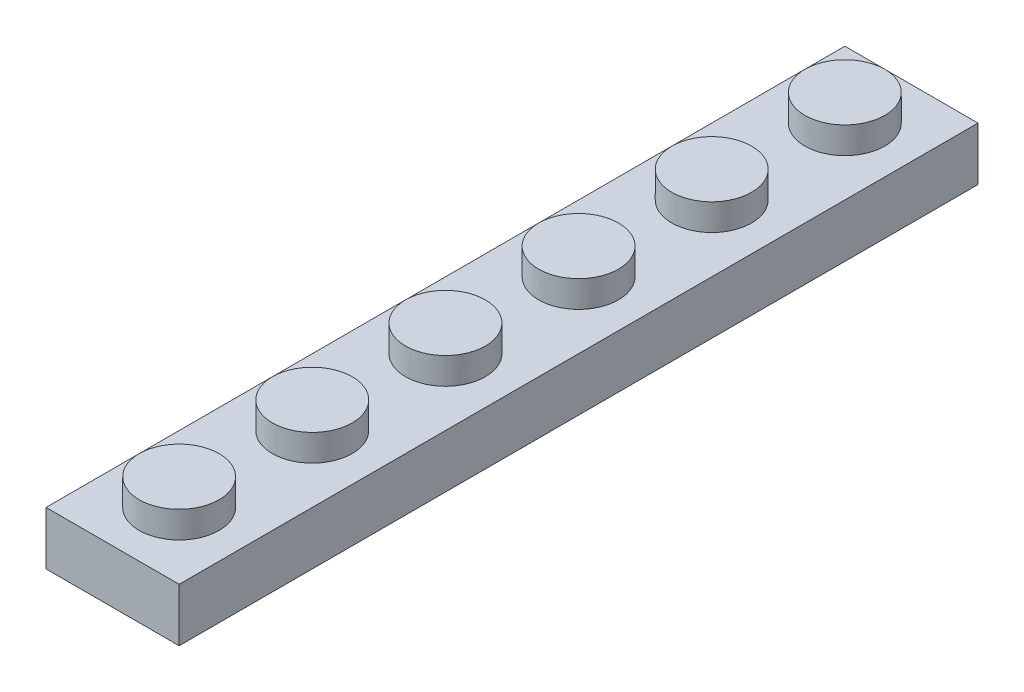
ISO-10303-21;
HEADER;
FILE_DESCRIPTION(('STEP AP214'),'2;1');
FILE_NAME('part.step','',(''),(''),'','','');
FILE_SCHEMA(('AUTOMOTIVE_DESIGN { 1 0 10303 214 1 1 1 1 }'));
ENDSEC;
DATA;
#1=APPLICATION_CONTEXT('core data for automotive mechanical design processes');
#2=APPLICATION_PROTOCOL_DEFINITION('international standard','automotive_design',2000,#1);
#3=PRODUCT_CONTEXT('',#1,'mechanical');
#4=PRODUCT('Part','Part','',(#3));
#5=PRODUCT_RELATED_PRODUCT_CATEGORY('part','',(#4));
#6=PRODUCT_DEFINITION_FORMATION('','',#4);
#7=PRODUCT_DEFINITION_CONTEXT('part definition',#1,'design');
#8=PRODUCT_DEFINITION('design','',#6,#7);
#9=PRODUCT_DEFINITION_SHAPE('','',#8);
#10=(LENGTH_UNIT() NAMED_UNIT(*) SI_UNIT(.MILLI.,.METRE.));
#11=(NAMED_UNIT(*) PLANE_ANGLE_UNIT() SI_UNIT($,.RADIAN.));
#12=(NAMED_UNIT(*) SI_UNIT($,.STERADIAN.) SOLID_ANGLE_UNIT());
#13=UNCERTAINTY_MEASURE_WITH_UNIT(LENGTH_MEASURE(1.E-05),#10,'distance_accuracy_value','');
#14=(GEOMETRIC_REPRESENTATION_CONTEXT(3) GLOBAL_UNCERTAINTY_ASSIGNED_CONTEXT((#13)) GLOBAL_UNIT_ASSIGNED_CONTEXT((#10,
#11,#12)) REPRESENTATION_CONTEXT('',''));
#15=CARTESIAN_POINT('',(0.,0.,0.));
#16=DIRECTION('',(0.,0.,1.));
#17=DIRECTION('',(1.,0.,0.));
#18=AXIS2_PLACEMENT_3D('',#15,#16,#17);
#19=CARTESIAN_POINT('',(0.,0.,0.));
#20=DIRECTION('',(0.,-1.,0.));
#21=DIRECTION('',(0.,0.,-1.));
#22=AXIS2_PLACEMENT_3D('',#19,#20,#21);
#23=PLANE('',#22);
#24=DIRECTION('',(0.,0.,1.));
#25=VECTOR('',#24,1.);
#26=CARTESIAN_POINT('',(0.,0.,0.));
#27=LINE('',#26,#25);
#28=CARTESIAN_POINT('',(0.,0.,-48.));
#29=VERTEX_POINT('',#28);
#30=CARTESIAN_POINT('',(0.,0.,0.));
#31=VERTEX_POINT('',#30);
#32=EDGE_CURVE('E208',#29,#31,#27,.T.);
#33=ORIENTED_EDGE('',*,*,#32,.F.);
#34=DIRECTION('',(-1.,0.,0.));
#35=VECTOR('',#34,1.);
#36=CARTESIAN_POINT('',(0.,0.,-48.));
#37=LINE('',#36,#35);
#38=CARTESIAN_POINT('',(8.,0.,-48.));
#39=VERTEX_POINT('',#38);
#40=EDGE_CURVE('E85',#39,#29,#37,.T.);
#41=ORIENTED_EDGE('',*,*,#40,.F.);
#42=DIRECTION('',(0.,0.,-1.));
#43=VECTOR('',#42,1.);
#44=CARTESIAN_POINT('',(8.,0.,0.));
#45=LINE('',#44,#43);
#46=CARTESIAN_POINT('',(8.,0.,0.));
#47=VERTEX_POINT('',#46);
#48=EDGE_CURVE('E226',#47,#39,#45,.T.);
#49=ORIENTED_EDGE('',*,*,#48,.F.);
#50=DIRECTION('',(1.,0.,0.));
#51=VECTOR('',#50,1.);
#52=CARTESIAN_POINT('',(0.,0.,0.));
#53=LINE('',#52,#51);
#54=EDGE_CURVE('E223',#31,#47,#53,.T.);
#55=ORIENTED_EDGE('',*,*,#54,.F.);
#56=EDGE_LOOP('',(#33,#41,#49,#55));
#57=FACE_BOUND('',#56,.T.);
#58=DIRECTION('',(-1.,0.,0.));
#59=VECTOR('',#58,1.);
#60=CARTESIAN_POINT('',(0.,0.,-46.4));
#61=LINE('',#60,#59);
#62=CARTESIAN_POINT('',(6.4,0.,-46.4));
#63=VERTEX_POINT('',#62);
#64=CARTESIAN_POINT('',(1.6,0.,-46.4));
#65=VERTEX_POINT('',#64);
#66=EDGE_CURVE('E191',#63,#65,#61,.T.);
#67=ORIENTED_EDGE('',*,*,#66,.T.);
#68=DIRECTION('',(0.,0.,1.));
#69=VECTOR('',#68,1.);
#70=CARTESIAN_POINT('',(1.6,0.,0.));
#71=LINE('',#70,#69);
#72=CARTESIAN_POINT('',(1.6,0.,-1.6));
#73=VERTEX_POINT('',#72);
#74=EDGE_CURVE('E182',#65,#73,#71,.T.);
#75=ORIENTED_EDGE('',*,*,#74,.T.);
#76=DIRECTION('',(1.,0.,0.));
#77=VECTOR('',#76,1.);
#78=CARTESIAN_POINT('',(0.,0.,-1.6));
#79=LINE('',#78,#77);
#80=CARTESIAN_POINT('',(6.4,0.,-1.6));
#81=VERTEX_POINT('',#80);
#82=EDGE_CURVE('E190',#73,#81,#79,.T.);
#83=ORIENTED_EDGE('',*,*,#82,.T.);
#84=DIRECTION('',(0.,0.,-1.));
#85=VECTOR('',#84,1.);
#86=CARTESIAN_POINT('',(6.4,0.,0.));
#87=LINE('',#86,#85);
#88=EDGE_CURVE('E55',#81,#63,#87,.T.);
#89=ORIENTED_EDGE('',*,*,#88,.T.);
#90=EDGE_LOOP('',(#67,#75,#83,#89));
#91=FACE_BOUND('',#90,.T.);
#92=ADVANCED_FACE('F39',(#57,#91),#23,.T.);
#93=CARTESIAN_POINT('',(4.,4.8,-44.));
#94=DIRECTION('',(0.,1.,0.));
#95=DIRECTION('',(0.,0.,1.));
#96=AXIS2_PLACEMENT_3D('',#93,#94,#95);
#97=PLANE('',#96);
#98=CARTESIAN_POINT('',(4.,4.8,-44.));
#99=DIRECTION('',(0.,1.,0.));
#100=DIRECTION('',(0.,0.,1.));
#101=AXIS2_PLACEMENT_3D('',#98,#99,#100);
#102=CIRCLE('',#101,2.4);
#103=CARTESIAN_POINT('',(4.,4.8,-41.6));
#104=VERTEX_POINT('',#103);
#105=EDGE_CURVE('E11',#104,#104,#102,.T.);
#106=ORIENTED_EDGE('',*,*,#105,.T.);
#107=EDGE_LOOP('',(#106));
#108=FACE_BOUND('',#107,.T.);
#109=ADVANCED_FACE('F41',(#108),#97,.T.);
#110=CARTESIAN_POINT('',(4.,4.8,-44.));
#111=DIRECTION('',(0.,-1.,0.));
#112=DIRECTION('',(0.,0.,-1.));
#113=AXIS2_PLACEMENT_3D('',#110,#111,#112);
#114=CYLINDRICAL_SURFACE('',#113,2.4);
#115=ORIENTED_EDGE('',*,*,#105,.F.);
#116=EDGE_LOOP('',(#115));
#117=FACE_BOUND('',#116,.T.);
#118=CARTESIAN_POINT('',(4.,3.2,-44.));
#119=DIRECTION('',(0.,-1.,0.));
#120=DIRECTION('',(0.,0.,-1.));
#121=AXIS2_PLACEMENT_3D('',#118,#119,#120);
#122=CIRCLE('',#121,2.4);
#123=CARTESIAN_POINT('',(4.,3.2,-46.4));
#124=VERTEX_POINT('',#123);
#125=EDGE_CURVE('E48',#124,#124,#122,.F.);
#126=ORIENTED_EDGE('',*,*,#125,.T.);
#127=EDGE_LOOP('',(#126));
#128=FACE_BOUND('',#127,.T.);
#129=ADVANCED_FACE('F278',(#117,#128),#114,.T.);
#130=CARTESIAN_POINT('',(4.,4.8,-36.));
#131=DIRECTION('',(0.,1.,0.));
#132=DIRECTION('',(0.,0.,1.));
#133=AXIS2_PLACEMENT_3D('',#130,#131,#132);
#134=PLANE('',#133);
#135=CARTESIAN_POINT('',(4.,4.8,-36.));
#136=DIRECTION('',(0.,1.,0.));
#137=DIRECTION('',(0.,0.,1.));
#138=AXIS2_PLACEMENT_3D('',#135,#136,#137);
#139=CIRCLE('',#138,2.4);
#140=CARTESIAN_POINT('',(4.,4.8,-33.6));
#141=VERTEX_POINT('',#140);
#142=EDGE_CURVE('E271',#141,#141,#139,.T.);
#143=ORIENTED_EDGE('',*,*,#142,.T.);
#144=EDGE_LOOP('',(#143));
#145=FACE_BOUND('',#144,.T.);
#146=ADVANCED_FACE('F336',(#145),#134,.T.);
#147=CARTESIAN_POINT('',(4.,4.8,-36.));
#148=DIRECTION('',(0.,-1.,0.));
#149=DIRECTION('',(0.,0.,-1.));
#150=AXIS2_PLACEMENT_3D('',#147,#148,#149);
#151=CYLINDRICAL_SURFACE('',#150,2.4);
#152=ORIENTED_EDGE('',*,*,#142,.F.);
#153=EDGE_LOOP('',(#152));
#154=FACE_BOUND('',#153,.T.);
#155=CARTESIAN_POINT('',(4.,3.2,-36.));
#156=DIRECTION('',(0.,-1.,0.));
#157=DIRECTION('',(0.,0.,-1.));
#158=AXIS2_PLACEMENT_3D('',#155,#156,#157);
#159=CIRCLE('',#158,2.4);
#160=CARTESIAN_POINT('',(4.,3.2,-38.4));
#161=VERTEX_POINT('',#160);
#162=EDGE_CURVE('E267',#161,#161,#159,.F.);
#163=ORIENTED_EDGE('',*,*,#162,.T.);
#164=EDGE_LOOP('',(#163));
#165=FACE_BOUND('',#164,.T.);
#166=ADVANCED_FACE('F332',(#154,#165),#151,.T.);
#167=CARTESIAN_POINT('',(4.,4.8,-28.));
#168=DIRECTION('',(0.,1.,0.));
#169=DIRECTION('',(0.,0.,1.));
#170=AXIS2_PLACEMENT_3D('',#167,#168,#169);
#171=PLANE('',#170);
#172=CARTESIAN_POINT('',(4.,4.8,-28.));
#173=DIRECTION('',(0.,1.,0.));
#174=DIRECTION('',(0.,0.,1.));
#175=AXIS2_PLACEMENT_3D('',#172,#173,#174);
#176=CIRCLE('',#175,2.4);
#177=CARTESIAN_POINT('',(4.,4.8,-25.6));
#178=VERTEX_POINT('',#177);
#179=EDGE_CURVE('E263',#178,#178,#176,.T.);
#180=ORIENTED_EDGE('',*,*,#179,.T.);
#181=EDGE_LOOP('',(#180));
#182=FACE_BOUND('',#181,.T.);
#183=ADVANCED_FACE('F328',(#182),#171,.T.);
#184=CARTESIAN_POINT('',(4.,4.8,-28.));
#185=DIRECTION('',(0.,-1.,0.));
#186=DIRECTION('',(0.,0.,-1.));
#187=AXIS2_PLACEMENT_3D('',#184,#185,#186);
#188=CYLINDRICAL_SURFACE('',#187,2.4);
#189=ORIENTED_EDGE('',*,*,#179,.F.);
#190=EDGE_LOOP('',(#189));
#191=FACE_BOUND('',#190,.T.);
#192=CARTESIAN_POINT('',(4.,3.2,-28.));
#193=DIRECTION('',(0.,-1.,0.));
#194=DIRECTION('',(0.,0.,-1.));
#195=AXIS2_PLACEMENT_3D('',#192,#193,#194);
#196=CIRCLE('',#195,2.4);
#197=CARTESIAN_POINT('',(4.,3.2,-30.4));
#198=VERTEX_POINT('',#197);
#199=EDGE_CURVE('E259',#198,#198,#196,.F.);
#200=ORIENTED_EDGE('',*,*,#199,.T.);
#201=EDGE_LOOP('',(#200));
#202=FACE_BOUND('',#201,.T.);
#203=ADVANCED_FACE('F324',(#191,#202),#188,.T.);
#204=CARTESIAN_POINT('',(4.,4.8,-20.));
#205=DIRECTION('',(0.,1.,0.));
#206=DIRECTION('',(0.,0.,1.));
#207=AXIS2_PLACEMENT_3D('',#204,#205,#206);
#208=PLANE('',#207);
#209=CARTESIAN_POINT('',(4.,4.8,-20.));
#210=DIRECTION('',(0.,1.,0.));
#211=DIRECTION('',(0.,0.,1.));
#212=AXIS2_PLACEMENT_3D('',#209,#210,#211);
#213=CIRCLE('',#212,2.4);
#214=CARTESIAN_POINT('',(4.,4.8,-17.6));
#215=VERTEX_POINT('',#214);
#216=EDGE_CURVE('E255',#215,#215,#213,.T.);
#217=ORIENTED_EDGE('',*,*,#216,.T.);
#218=EDGE_LOOP('',(#217));
#219=FACE_BOUND('',#218,.T.);
#220=ADVANCED_FACE('F320',(#219),#208,.T.);
#221=CARTESIAN_POINT('',(4.,4.8,-20.));
#222=DIRECTION('',(0.,-1.,0.));
#223=DIRECTION('',(0.,0.,-1.));
#224=AXIS2_PLACEMENT_3D('',#221,#222,#223);
#225=CYLINDRICAL_SURFACE('',#224,2.4);
#226=ORIENTED_EDGE('',*,*,#216,.F.);
#227=EDGE_LOOP('',(#226));
#228=FACE_BOUND('',#227,.T.);
#229=CARTESIAN_POINT('',(4.,3.2,-20.));
#230=DIRECTION('',(0.,-1.,0.));
#231=DIRECTION('',(0.,0.,-1.));
#232=AXIS2_PLACEMENT_3D('',#229,#230,#231);
#233=CIRCLE('',#232,2.4);
#234=CARTESIAN_POINT('',(4.,3.2,-22.4));
#235=VERTEX_POINT('',#234);
#236=EDGE_CURVE('E251',#235,#235,#233,.F.);
#237=ORIENTED_EDGE('',*,*,#236,.T.);
#238=EDGE_LOOP('',(#237));
#239=FACE_BOUND('',#238,.T.);
#240=ADVANCED_FACE('F316',(#228,#239),#225,.T.);
#241=CARTESIAN_POINT('',(0.,3.2,0.));
#242=DIRECTION('',(1.,0.,0.));
#243=DIRECTION('',(0.,0.,-1.));
#244=AXIS2_PLACEMENT_3D('',#241,#242,#243);
#245=PLANE('',#244);
#246=ORIENTED_EDGE('',*,*,#32,.T.);
#247=DIRECTION('',(0.,-1.,0.));
#248=VECTOR('',#247,1.);
#249=CARTESIAN_POINT('',(0.,3.2,0.));
#250=LINE('',#249,#248);
#251=CARTESIAN_POINT('',(0.,3.2,0.));
#252=VERTEX_POINT('',#251);
#253=EDGE_CURVE('E240',#252,#31,#250,.T.);
#254=ORIENTED_EDGE('',*,*,#253,.F.);
#255=DIRECTION('',(0.,0.,1.));
#256=VECTOR('',#255,1.);
#257=CARTESIAN_POINT('',(0.,3.2,0.));
#258=LINE('',#257,#256);
#259=CARTESIAN_POINT('',(0.,3.2,-48.));
#260=VERTEX_POINT('',#259);
#261=EDGE_CURVE('E209',#260,#252,#258,.T.);
#262=ORIENTED_EDGE('',*,*,#261,.F.);
#263=DIRECTION('',(0.,-1.,0.));
#264=VECTOR('',#263,1.);
#265=CARTESIAN_POINT('',(0.,3.2,-48.));
#266=LINE('',#265,#264);
#267=EDGE_CURVE('E219',#260,#29,#266,.T.);
#268=ORIENTED_EDGE('',*,*,#267,.T.);
#269=EDGE_LOOP('',(#246,#254,#262,#268));
#270=FACE_BOUND('',#269,.T.);
#271=ADVANCED_FACE('F313',(#270),#245,.F.);
#272=CARTESIAN_POINT('',(0.,3.2,0.));
#273=DIRECTION('',(0.,0.,-1.));
#274=DIRECTION('',(-1.,0.,0.));
#275=AXIS2_PLACEMENT_3D('',#272,#273,#274);
#276=PLANE('',#275);
#277=ORIENTED_EDGE('',*,*,#54,.T.);
#278=DIRECTION('',(0.,-1.,0.));
#279=VECTOR('',#278,1.);
#280=CARTESIAN_POINT('',(8.,3.2,0.));
#281=LINE('',#280,#279);
#282=CARTESIAN_POINT('',(8.,3.2,0.));
#283=VERTEX_POINT('',#282);
#284=EDGE_CURVE('E236',#283,#47,#281,.T.);
#285=ORIENTED_EDGE('',*,*,#284,.F.);
#286=DIRECTION('',(1.,0.,0.));
#287=VECTOR('',#286,1.);
#288=CARTESIAN_POINT('',(0.,3.2,0.));
#289=LINE('',#288,#287);
#290=EDGE_CURVE('E93',#252,#283,#289,.T.);
#291=ORIENTED_EDGE('',*,*,#290,.F.);
#292=ORIENTED_EDGE('',*,*,#253,.T.);
#293=EDGE_LOOP('',(#277,#285,#291,#292));
#294=FACE_BOUND('',#293,.T.);
#295=ADVANCED_FACE('F309',(#294),#276,.F.);
#296=CARTESIAN_POINT('',(8.,3.2,0.));
#297=DIRECTION('',(-1.,0.,0.));
#298=DIRECTION('',(0.,0.,1.));
#299=AXIS2_PLACEMENT_3D('',#296,#297,#298);
#300=PLANE('',#299);
#301=ORIENTED_EDGE('',*,*,#48,.T.);
#302=DIRECTION('',(0.,-1.,0.));
#303=VECTOR('',#302,1.);
#304=CARTESIAN_POINT('',(8.,3.2,-48.));
#305=LINE('',#304,#303);
#306=CARTESIAN_POINT('',(8.,3.2,-48.));
#307=VERTEX_POINT('',#306);
#308=EDGE_CURVE('E233',#307,#39,#305,.T.);
#309=ORIENTED_EDGE('',*,*,#308,.F.);
#310=DIRECTION('',(0.,0.,-1.));
#311=VECTOR('',#310,1.);
#312=CARTESIAN_POINT('',(8.,3.2,0.));
#313=LINE('',#312,#311);
#314=EDGE_CURVE('E214',#283,#307,#313,.T.);
#315=ORIENTED_EDGE('',*,*,#314,.F.);
#316=ORIENTED_EDGE('',*,*,#284,.T.);
#317=EDGE_LOOP('',(#301,#309,#315,#316));
#318=FACE_BOUND('',#317,.T.);
#319=ADVANCED_FACE('F293',(#318),#300,.F.);
#320=CARTESIAN_POINT('',(0.,3.2,-48.));
#321=DIRECTION('',(0.,0.,1.));
#322=DIRECTION('',(1.,0.,0.));
#323=AXIS2_PLACEMENT_3D('',#320,#321,#322);
#324=PLANE('',#323);
#325=ORIENTED_EDGE('',*,*,#40,.T.);
#326=ORIENTED_EDGE('',*,*,#267,.F.);
#327=DIRECTION('',(-1.,0.,0.));
#328=VECTOR('',#327,1.);
#329=CARTESIAN_POINT('',(0.,3.2,-48.));
#330=LINE('',#329,#328);
#331=EDGE_CURVE('E64',#307,#260,#330,.T.);
#332=ORIENTED_EDGE('',*,*,#331,.F.);
#333=ORIENTED_EDGE('',*,*,#308,.T.);
#334=EDGE_LOOP('',(#325,#326,#332,#333));
#335=FACE_BOUND('',#334,.T.);
#336=ADVANCED_FACE('F283',(#335),#324,.F.);
#337=CARTESIAN_POINT('',(0.,3.2,0.));
#338=DIRECTION('',(0.,-1.,0.));
#339=DIRECTION('',(0.,0.,-1.));
#340=AXIS2_PLACEMENT_3D('',#337,#338,#339);
#341=PLANE('',#340);
#342=CARTESIAN_POINT('',(4.,3.2,-12.));
#343=DIRECTION('',(0.,-1.,0.));
#344=DIRECTION('',(0.,0.,-1.));
#345=AXIS2_PLACEMENT_3D('',#342,#343,#344);
#346=CIRCLE('',#345,2.4);
#347=CARTESIAN_POINT('',(4.,3.2,-14.4));
#348=VERTEX_POINT('',#347);
#349=EDGE_CURVE('E247',#348,#348,#346,.F.);
#350=ORIENTED_EDGE('',*,*,#349,.F.);
#351=EDGE_LOOP('',(#350));
#352=FACE_BOUND('',#351,.T.);
#353=CARTESIAN_POINT('',(4.,3.2,-4.));
#354=DIRECTION('',(0.,-1.,0.));
#355=DIRECTION('',(0.,0.,-1.));
#356=AXIS2_PLACEMENT_3D('',#353,#354,#355);
#357=CIRCLE('',#356,2.4);
#358=CARTESIAN_POINT('',(4.,3.2,-6.4));
#359=VERTEX_POINT('',#358);
#360=EDGE_CURVE('E243',#359,#359,#357,.F.);
#361=ORIENTED_EDGE('',*,*,#360,.F.);
#362=EDGE_LOOP('',(#361));
#363=FACE_BOUND('',#362,.T.);
#364=ORIENTED_EDGE('',*,*,#261,.T.);
#365=ORIENTED_EDGE('',*,*,#290,.T.);
#366=ORIENTED_EDGE('',*,*,#314,.T.);
#367=ORIENTED_EDGE('',*,*,#331,.T.);
#368=EDGE_LOOP('',(#364,#365,#366,#367));
#369=FACE_BOUND('',#368,.T.);
#370=ORIENTED_EDGE('',*,*,#236,.F.);
#371=EDGE_LOOP('',(#370));
#372=FACE_BOUND('',#371,.T.);
#373=ORIENTED_EDGE('',*,*,#199,.F.);
#374=EDGE_LOOP('',(#373));
#375=FACE_BOUND('',#374,.T.);
#376=ORIENTED_EDGE('',*,*,#162,.F.);
#377=EDGE_LOOP('',(#376));
#378=FACE_BOUND('',#377,.T.);
#379=ORIENTED_EDGE('',*,*,#125,.F.);
#380=EDGE_LOOP('',(#379));
#381=FACE_BOUND('',#380,.T.);
#382=ADVANCED_FACE('F280',(#352,#363,#369,#372,#375,#378,#381),#341,.F.);
#383=CARTESIAN_POINT('',(4.,4.8,-4.));
#384=DIRECTION('',(0.,-1.,0.));
#385=DIRECTION('',(0.,0.,-1.));
#386=AXIS2_PLACEMENT_3D('',#383,#384,#385);
#387=CYLINDRICAL_SURFACE('',#386,2.4);
#388=CARTESIAN_POINT('',(4.,4.8,-4.));
#389=DIRECTION('',(0.,1.,0.));
#390=DIRECTION('',(0.,0.,1.));
#391=AXIS2_PLACEMENT_3D('',#388,#389,#390);
#392=CIRCLE('',#391,2.4);
#393=CARTESIAN_POINT('',(4.,4.8,-1.6));
#394=VERTEX_POINT('',#393);
#395=EDGE_CURVE('E203',#394,#394,#392,.T.);
#396=ORIENTED_EDGE('',*,*,#395,.F.);
#397=EDGE_LOOP('',(#396));
#398=FACE_BOUND('',#397,.T.);
#399=ORIENTED_EDGE('',*,*,#360,.T.);
#400=EDGE_LOOP('',(#399));
#401=FACE_BOUND('',#400,.T.);
#402=ADVANCED_FACE('F282',(#398,#401),#387,.T.);
#403=CARTESIAN_POINT('',(4.,4.8,-4.));
#404=DIRECTION('',(0.,1.,0.));
#405=DIRECTION('',(0.,0.,1.));
#406=AXIS2_PLACEMENT_3D('',#403,#404,#405);
#407=PLANE('',#406);
#408=ORIENTED_EDGE('',*,*,#395,.T.);
#409=EDGE_LOOP('',(#408));
#410=FACE_BOUND('',#409,.T.);
#411=ADVANCED_FACE('F290',(#410),#407,.T.);
#412=CARTESIAN_POINT('',(4.,4.8,-12.));
#413=DIRECTION('',(0.,-1.,0.));
#414=DIRECTION('',(0.,0.,-1.));
#415=AXIS2_PLACEMENT_3D('',#412,#413,#414);
#416=CYLINDRICAL_SURFACE('',#415,2.4);
#417=CARTESIAN_POINT('',(4.,4.8,-12.));
#418=DIRECTION('',(0.,1.,0.));
#419=DIRECTION('',(0.,0.,1.));
#420=AXIS2_PLACEMENT_3D('',#417,#418,#419);
#421=CIRCLE('',#420,2.4);
#422=CARTESIAN_POINT('',(4.,4.8,-9.6));
#423=VERTEX_POINT('',#422);
#424=EDGE_CURVE('E199',#423,#423,#421,.T.);
#425=ORIENTED_EDGE('',*,*,#424,.F.);
#426=EDGE_LOOP('',(#425));
#427=FACE_BOUND('',#426,.T.);
#428=ORIENTED_EDGE('',*,*,#349,.T.);
#429=EDGE_LOOP('',(#428));
#430=FACE_BOUND('',#429,.T.);
#431=ADVANCED_FACE('F402',(#427,#430),#416,.T.);
#432=CARTESIAN_POINT('',(4.,4.8,-12.));
#433=DIRECTION('',(0.,1.,0.));
#434=DIRECTION('',(0.,0.,1.));
#435=AXIS2_PLACEMENT_3D('',#432,#433,#434);
#436=PLANE('',#435);
#437=ORIENTED_EDGE('',*,*,#424,.T.);
#438=EDGE_LOOP('',(#437));
#439=FACE_BOUND('',#438,.T.);
#440=ADVANCED_FACE('F432',(#439),#436,.T.);
#441=CARTESIAN_POINT('',(4.,3.2,-44.));
#442=DIRECTION('',(0.,1.,0.));
#443=DIRECTION('',(0.,0.,1.));
#444=AXIS2_PLACEMENT_3D('',#441,#442,#443);
#445=PLANE('',#444);
#446=CARTESIAN_POINT('',(4.,3.2,-44.));
#447=DIRECTION('',(0.,1.,0.));
#448=DIRECTION('',(0.,0.,1.));
#449=AXIS2_PLACEMENT_3D('',#446,#447,#448);
#450=CIRCLE('',#449,0.799999999999999);
#451=CARTESIAN_POINT('',(4.,3.2,-43.2));
#452=VERTEX_POINT('',#451);
#453=EDGE_CURVE('E204',#452,#452,#450,.T.);
#454=ORIENTED_EDGE('',*,*,#453,.F.);
#455=EDGE_LOOP('',(#454));
#456=FACE_BOUND('',#455,.T.);
#457=ADVANCED_FACE('F441',(#456),#445,.F.);
#458=CARTESIAN_POINT('',(4.,4.8,-44.));
#459=DIRECTION('',(0.,-1.,0.));
#460=DIRECTION('',(0.,0.,-1.));
#461=AXIS2_PLACEMENT_3D('',#458,#459,#460);
#462=CYLINDRICAL_SURFACE('',#461,0.799999999999999);
#463=ORIENTED_EDGE('',*,*,#453,.T.);
#464=EDGE_LOOP('',(#463));
#465=FACE_BOUND('',#464,.T.);
#466=CARTESIAN_POINT('',(4.,1.6,-44.));
#467=DIRECTION('',(0.,-1.,0.));
#468=DIRECTION('',(0.,0.,-1.));
#469=AXIS2_PLACEMENT_3D('',#466,#467,#468);
#470=CIRCLE('',#469,0.799999999999999);
#471=CARTESIAN_POINT('',(4.,1.6,-44.8));
#472=VERTEX_POINT('',#471);
#473=EDGE_CURVE('E164',#472,#472,#470,.F.);
#474=ORIENTED_EDGE('',*,*,#473,.F.);
#475=EDGE_LOOP('',(#474));
#476=FACE_BOUND('',#475,.T.);
#477=ADVANCED_FACE('F454',(#465,#476),#462,.F.);
#478=CARTESIAN_POINT('',(4.,3.2,-36.));
#479=DIRECTION('',(0.,1.,0.));
#480=DIRECTION('',(0.,0.,1.));
#481=AXIS2_PLACEMENT_3D('',#478,#479,#480);
#482=PLANE('',#481);
#483=CARTESIAN_POINT('',(4.,3.2,-36.));
#484=DIRECTION('',(0.,1.,0.));
#485=DIRECTION('',(0.,0.,1.));
#486=AXIS2_PLACEMENT_3D('',#483,#484,#485);
#487=CIRCLE('',#486,0.799999999999999);
#488=CARTESIAN_POINT('',(4.,3.2,-35.2));
#489=VERTEX_POINT('',#488);
#490=EDGE_CURVE('E160',#489,#489,#487,.T.);
#491=ORIENTED_EDGE('',*,*,#490,.F.);
#492=EDGE_LOOP('',(#491));
#493=FACE_BOUND('',#492,.T.);
#494=ADVANCED_FACE('F463',(#493),#482,.F.);
#495=CARTESIAN_POINT('',(4.,4.8,-36.));
#496=DIRECTION('',(0.,-1.,0.));
#497=DIRECTION('',(0.,0.,-1.));
#498=AXIS2_PLACEMENT_3D('',#495,#496,#497);
#499=CYLINDRICAL_SURFACE('',#498,0.799999999999999);
#500=ORIENTED_EDGE('',*,*,#490,.T.);
#501=EDGE_LOOP('',(#500));
#502=FACE_BOUND('',#501,.T.);
#503=CARTESIAN_POINT('',(4.,1.6,-36.));
#504=DIRECTION('',(0.,-1.,0.));
#505=DIRECTION('',(0.,0.,-1.));
#506=AXIS2_PLACEMENT_3D('',#503,#504,#505);
#507=CIRCLE('',#506,0.799999999999999);
#508=CARTESIAN_POINT('',(4.,1.6,-36.8));
#509=VERTEX_POINT('',#508);
#510=EDGE_CURVE('E156',#509,#509,#507,.F.);
#511=ORIENTED_EDGE('',*,*,#510,.F.);
#512=EDGE_LOOP('',(#511));
#513=FACE_BOUND('',#512,.T.);
#514=ADVANCED_FACE('F472',(#502,#513),#499,.F.);
#515=CARTESIAN_POINT('',(4.,3.2,-28.));
#516=DIRECTION('',(0.,1.,0.));
#517=DIRECTION('',(0.,0.,1.));
#518=AXIS2_PLACEMENT_3D('',#515,#516,#517);
#519=PLANE('',#518);
#520=CARTESIAN_POINT('',(4.,3.2,-28.));
#521=DIRECTION('',(0.,1.,0.));
#522=DIRECTION('',(0.,0.,1.));
#523=AXIS2_PLACEMENT_3D('',#520,#521,#522);
#524=CIRCLE('',#523,0.799999999999999);
#525=CARTESIAN_POINT('',(4.,3.2,-27.2));
#526=VERTEX_POINT('',#525);
#527=EDGE_CURVE('E155',#526,#526,#524,.T.);
#528=ORIENTED_EDGE('',*,*,#527,.F.);
#529=EDGE_LOOP('',(#528));
#530=FACE_BOUND('',#529,.T.);
#531=ADVANCED_FACE('F481',(#530),#519,.F.);
#532=CARTESIAN_POINT('',(4.,4.8,-28.));
#533=DIRECTION('',(0.,-1.,0.));
#534=DIRECTION('',(0.,0.,-1.));
#535=AXIS2_PLACEMENT_3D('',#532,#533,#534);
#536=CYLINDRICAL_SURFACE('',#535,0.799999999999999);
#537=ORIENTED_EDGE('',*,*,#527,.T.);
#538=EDGE_LOOP('',(#537));
#539=FACE_BOUND('',#538,.T.);
#540=CARTESIAN_POINT('',(4.,1.6,-28.));
#541=DIRECTION('',(0.,-1.,0.));
#542=DIRECTION('',(0.,0.,-1.));
#543=AXIS2_PLACEMENT_3D('',#540,#541,#542);
#544=CIRCLE('',#543,0.799999999999999);
#545=CARTESIAN_POINT('',(4.,1.6,-28.8));
#546=VERTEX_POINT('',#545);
#547=EDGE_CURVE('E151',#546,#546,#544,.F.);
#548=ORIENTED_EDGE('',*,*,#547,.F.);
#549=EDGE_LOOP('',(#548));
#550=FACE_BOUND('',#549,.T.);
#551=ADVANCED_FACE('F490',(#539,#550),#536,.F.);
#552=CARTESIAN_POINT('',(4.,3.2,-20.));
#553=DIRECTION('',(0.,1.,0.));
#554=DIRECTION('',(0.,0.,1.));
#555=AXIS2_PLACEMENT_3D('',#552,#553,#554);
#556=PLANE('',#555);
#557=CARTESIAN_POINT('',(4.,3.2,-20.));
#558=DIRECTION('',(0.,1.,0.));
#559=DIRECTION('',(0.,0.,1.));
#560=AXIS2_PLACEMENT_3D('',#557,#558,#559);
#561=CIRCLE('',#560,0.799999999999999);
#562=CARTESIAN_POINT('',(4.,3.2,-19.2));
#563=VERTEX_POINT('',#562);
#564=EDGE_CURVE('E149',#563,#563,#561,.T.);
#565=ORIENTED_EDGE('',*,*,#564,.F.);
#566=EDGE_LOOP('',(#565));
#567=FACE_BOUND('',#566,.T.);
#568=ADVANCED_FACE('F499',(#567),#556,.F.);
#569=CARTESIAN_POINT('',(4.,4.8,-20.));
#570=DIRECTION('',(0.,-1.,0.));
#571=DIRECTION('',(0.,0.,-1.));
#572=AXIS2_PLACEMENT_3D('',#569,#570,#571);
#573=CYLINDRICAL_SURFACE('',#572,0.799999999999999);
#574=ORIENTED_EDGE('',*,*,#564,.T.);
#575=EDGE_LOOP('',(#574));
#576=FACE_BOUND('',#575,.T.);
#577=CARTESIAN_POINT('',(4.,1.6,-20.));
#578=DIRECTION('',(0.,-1.,0.));
#579=DIRECTION('',(0.,0.,-1.));
#580=AXIS2_PLACEMENT_3D('',#577,#578,#579);
#581=CIRCLE('',#580,0.799999999999999);
#582=CARTESIAN_POINT('',(4.,1.6,-20.8));
#583=VERTEX_POINT('',#582);
#584=EDGE_CURVE('E145',#583,#583,#581,.F.);
#585=ORIENTED_EDGE('',*,*,#584,.F.);
#586=EDGE_LOOP('',(#585));
#587=FACE_BOUND('',#586,.T.);
#588=ADVANCED_FACE('F508',(#576,#587),#573,.F.);
#589=CARTESIAN_POINT('',(1.6,3.2,0.));
#590=DIRECTION('',(1.,0.,0.));
#591=DIRECTION('',(0.,0.,-1.));
#592=AXIS2_PLACEMENT_3D('',#589,#590,#591);
#593=PLANE('',#592);
#594=ORIENTED_EDGE('',*,*,#74,.F.);
#595=DIRECTION('',(0.,-1.,0.));
#596=VECTOR('',#595,1.);
#597=CARTESIAN_POINT('',(1.6,3.2,-46.4));
#598=LINE('',#597,#596);
#599=CARTESIAN_POINT('',(1.6,1.6,-46.4));
#600=VERTEX_POINT('',#599);
#601=EDGE_CURVE('E141',#600,#65,#598,.T.);
#602=ORIENTED_EDGE('',*,*,#601,.F.);
#603=DIRECTION('',(0.,0.,1.));
#604=VECTOR('',#603,1.);
#605=CARTESIAN_POINT('',(1.6,1.6,0.));
#606=LINE('',#605,#604);
#607=CARTESIAN_POINT('',(1.6,1.6,-1.6));
#608=VERTEX_POINT('',#607);
#609=EDGE_CURVE('E127',#600,#608,#606,.T.);
#610=ORIENTED_EDGE('',*,*,#609,.T.);
#611=DIRECTION('',(0.,-1.,0.));
#612=VECTOR('',#611,1.);
#613=CARTESIAN_POINT('',(1.6,3.2,-1.6));
#614=LINE('',#613,#612);
#615=EDGE_CURVE('E120',#608,#73,#614,.T.);
#616=ORIENTED_EDGE('',*,*,#615,.T.);
#617=EDGE_LOOP('',(#594,#602,#610,#616));
#618=FACE_BOUND('',#617,.T.);
#619=ADVANCED_FACE('F517',(#618),#593,.T.);
#620=CARTESIAN_POINT('',(0.,3.2,-1.6));
#621=DIRECTION('',(0.,0.,-1.));
#622=DIRECTION('',(-1.,0.,0.));
#623=AXIS2_PLACEMENT_3D('',#620,#621,#622);
#624=PLANE('',#623);
#625=ORIENTED_EDGE('',*,*,#82,.F.);
#626=ORIENTED_EDGE('',*,*,#615,.F.);
#627=DIRECTION('',(1.,0.,0.));
#628=VECTOR('',#627,1.);
#629=CARTESIAN_POINT('',(0.,1.6,-1.6));
#630=LINE('',#629,#628);
#631=CARTESIAN_POINT('',(6.4,1.6,-1.6));
#632=VERTEX_POINT('',#631);
#633=EDGE_CURVE('E115',#608,#632,#630,.T.);
#634=ORIENTED_EDGE('',*,*,#633,.T.);
#635=DIRECTION('',(0.,-1.,0.));
#636=VECTOR('',#635,1.);
#637=CARTESIAN_POINT('',(6.4,3.2,-1.6));
#638=LINE('',#637,#636);
#639=EDGE_CURVE('E117',#632,#81,#638,.T.);
#640=ORIENTED_EDGE('',*,*,#639,.T.);
#641=EDGE_LOOP('',(#625,#626,#634,#640));
#642=FACE_BOUND('',#641,.T.);
#643=ADVANCED_FACE('F116',(#642),#624,.T.);
#644=CARTESIAN_POINT('',(6.4,3.2,0.));
#645=DIRECTION('',(-1.,0.,0.));
#646=DIRECTION('',(0.,0.,1.));
#647=AXIS2_PLACEMENT_3D('',#644,#645,#646);
#648=PLANE('',#647);
#649=ORIENTED_EDGE('',*,*,#88,.F.);
#650=ORIENTED_EDGE('',*,*,#639,.F.);
#651=DIRECTION('',(0.,0.,-1.));
#652=VECTOR('',#651,1.);
#653=CARTESIAN_POINT('',(6.4,1.6,0.));
#654=LINE('',#653,#652);
#655=CARTESIAN_POINT('',(6.4,1.6,-46.4));
#656=VERTEX_POINT('',#655);
#657=EDGE_CURVE('E126',#632,#656,#654,.T.);
#658=ORIENTED_EDGE('',*,*,#657,.T.);
#659=DIRECTION('',(0.,-1.,0.));
#660=VECTOR('',#659,1.);
#661=CARTESIAN_POINT('',(6.4,3.2,-46.4));
#662=LINE('',#661,#660);
#663=EDGE_CURVE('E132',#656,#63,#662,.T.);
#664=ORIENTED_EDGE('',*,*,#663,.T.);
#665=EDGE_LOOP('',(#649,#650,#658,#664));
#666=FACE_BOUND('',#665,.T.);
#667=ADVANCED_FACE('F129',(#666),#648,.T.);
#668=CARTESIAN_POINT('',(0.,3.2,-46.4));
#669=DIRECTION('',(0.,0.,1.));
#670=DIRECTION('',(1.,0.,0.));
#671=AXIS2_PLACEMENT_3D('',#668,#669,#670);
#672=PLANE('',#671);
#673=ORIENTED_EDGE('',*,*,#66,.F.);
#674=ORIENTED_EDGE('',*,*,#663,.F.);
#675=DIRECTION('',(-1.,0.,0.));
#676=VECTOR('',#675,1.);
#677=CARTESIAN_POINT('',(0.,1.6,-46.4));
#678=LINE('',#677,#676);
#679=EDGE_CURVE('E137',#656,#600,#678,.T.);
#680=ORIENTED_EDGE('',*,*,#679,.T.);
#681=ORIENTED_EDGE('',*,*,#601,.T.);
#682=EDGE_LOOP('',(#673,#674,#680,#681));
#683=FACE_BOUND('',#682,.T.);
#684=ADVANCED_FACE('F541',(#683),#672,.T.);
#685=CARTESIAN_POINT('',(0.,1.6,0.));
#686=DIRECTION('',(0.,-1.,0.));
#687=DIRECTION('',(0.,0.,-1.));
#688=AXIS2_PLACEMENT_3D('',#685,#686,#687);
#689=PLANE('',#688);
#690=CARTESIAN_POINT('',(4.,1.6,-12.));
#691=DIRECTION('',(0.,-1.,0.));
#692=DIRECTION('',(0.,0.,-1.));
#693=AXIS2_PLACEMENT_3D('',#690,#691,#692);
#694=CIRCLE('',#693,0.799999999999999);
#695=CARTESIAN_POINT('',(4.,1.6,-12.8));
#696=VERTEX_POINT('',#695);
#697=EDGE_CURVE('E150',#696,#696,#694,.F.);
#698=ORIENTED_EDGE('',*,*,#697,.T.);
#699=EDGE_LOOP('',(#698));
#700=FACE_BOUND('',#699,.T.);
#701=CARTESIAN_POINT('',(4.,1.6,-4.));
#702=DIRECTION('',(0.,-1.,0.));
#703=DIRECTION('',(0.,0.,-1.));
#704=AXIS2_PLACEMENT_3D('',#701,#702,#703);
#705=CIRCLE('',#704,0.799999999999999);
#706=CARTESIAN_POINT('',(4.,1.6,-4.8));
#707=VERTEX_POINT('',#706);
#708=EDGE_CURVE('E173',#707,#707,#705,.F.);
#709=ORIENTED_EDGE('',*,*,#708,.T.);
#710=EDGE_LOOP('',(#709));
#711=FACE_BOUND('',#710,.T.);
#712=ORIENTED_EDGE('',*,*,#609,.F.);
#713=ORIENTED_EDGE('',*,*,#679,.F.);
#714=ORIENTED_EDGE('',*,*,#657,.F.);
#715=ORIENTED_EDGE('',*,*,#633,.F.);
#716=EDGE_LOOP('',(#712,#713,#714,#715));
#717=FACE_BOUND('',#716,.T.);
#718=ORIENTED_EDGE('',*,*,#584,.T.);
#719=EDGE_LOOP('',(#718));
#720=FACE_BOUND('',#719,.T.);
#721=ORIENTED_EDGE('',*,*,#547,.T.);
#722=EDGE_LOOP('',(#721));
#723=FACE_BOUND('',#722,.T.);
#724=ORIENTED_EDGE('',*,*,#510,.T.);
#725=EDGE_LOOP('',(#724));
#726=FACE_BOUND('',#725,.T.);
#727=ORIENTED_EDGE('',*,*,#473,.T.);
#728=EDGE_LOOP('',(#727));
#729=FACE_BOUND('',#728,.T.);
#730=ADVANCED_FACE('F135',(#700,#711,#717,#720,#723,#726,#729),#689,.T.);
#731=CARTESIAN_POINT('',(4.,4.8,-4.));
#732=DIRECTION('',(0.,-1.,0.));
#733=DIRECTION('',(0.,0.,-1.));
#734=AXIS2_PLACEMENT_3D('',#731,#732,#733);
#735=CYLINDRICAL_SURFACE('',#734,0.799999999999999);
#736=CARTESIAN_POINT('',(4.,3.2,-4.));
#737=DIRECTION('',(0.,1.,0.));
#738=DIRECTION('',(0.,0.,1.));
#739=AXIS2_PLACEMENT_3D('',#736,#737,#738);
#740=CIRCLE('',#739,0.799999999999999);
#741=CARTESIAN_POINT('',(4.,3.2,-3.2));
#742=VERTEX_POINT('',#741);
#743=EDGE_CURVE('E178',#742,#742,#740,.T.);
#744=ORIENTED_EDGE('',*,*,#743,.T.);
#745=EDGE_LOOP('',(#744));
#746=FACE_BOUND('',#745,.T.);
#747=ORIENTED_EDGE('',*,*,#708,.F.);
#748=EDGE_LOOP('',(#747));
#749=FACE_BOUND('',#748,.T.);
#750=ADVANCED_FACE('F557',(#746,#749),#735,.F.);
#751=CARTESIAN_POINT('',(4.,3.2,-4.));
#752=DIRECTION('',(0.,1.,0.));
#753=DIRECTION('',(0.,0.,1.));
#754=AXIS2_PLACEMENT_3D('',#751,#752,#753);
#755=PLANE('',#754);
#756=ORIENTED_EDGE('',*,*,#743,.F.);
#757=EDGE_LOOP('',(#756));
#758=FACE_BOUND('',#757,.T.);
#759=ADVANCED_FACE('F566',(#758),#755,.F.);
#760=CARTESIAN_POINT('',(4.,4.8,-12.));
#761=DIRECTION('',(0.,-1.,0.));
#762=DIRECTION('',(0.,0.,-1.));
#763=AXIS2_PLACEMENT_3D('',#760,#761,#762);
#764=CYLINDRICAL_SURFACE('',#763,0.799999999999999);
#765=CARTESIAN_POINT('',(4.,3.2,-12.));
#766=DIRECTION('',(0.,1.,0.));
#767=DIRECTION('',(0.,0.,1.));
#768=AXIS2_PLACEMENT_3D('',#765,#766,#767);
#769=CIRCLE('',#768,0.799999999999999);
#770=CARTESIAN_POINT('',(4.,3.2,-11.2));
#771=VERTEX_POINT('',#770);
#772=EDGE_CURVE('E183',#771,#771,#769,.T.);
#773=ORIENTED_EDGE('',*,*,#772,.T.);
#774=EDGE_LOOP('',(#773));
#775=FACE_BOUND('',#774,.T.);
#776=ORIENTED_EDGE('',*,*,#697,.F.);
#777=EDGE_LOOP('',(#776));
#778=FACE_BOUND('',#777,.T.);
#779=ADVANCED_FACE('F575',(#775,#778),#764,.F.);
#780=CARTESIAN_POINT('',(4.,3.2,-12.));
#781=DIRECTION('',(0.,1.,0.));
#782=DIRECTION('',(0.,0.,1.));
#783=AXIS2_PLACEMENT_3D('',#780,#781,#782);
#784=PLANE('',#783);
#785=ORIENTED_EDGE('',*,*,#772,.F.);
#786=EDGE_LOOP('',(#785));
#787=FACE_BOUND('',#786,.T.);
#788=ADVANCED_FACE('F584',(#787),#784,.F.);
#789=CLOSED_SHELL('',(#92,#109,#129,#146,#166,#183,#203,#220,#240,#271,#295,#319,#336,#382,#402,
#411,#431,#440,#457,#477,#494,#514,#531,#551,#568,#588,#619,#643,#667,#684,#730,#750,#759,#779,#788));
#790=MANIFOLD_SOLID_BREP('B2',#789);
#791=ADVANCED_BREP_SHAPE_REPRESENTATION('',(#18,#790),#14);
#792=SHAPE_DEFINITION_REPRESENTATION(#9,#791);
ENDSEC;
END-ISO-10303-21;
